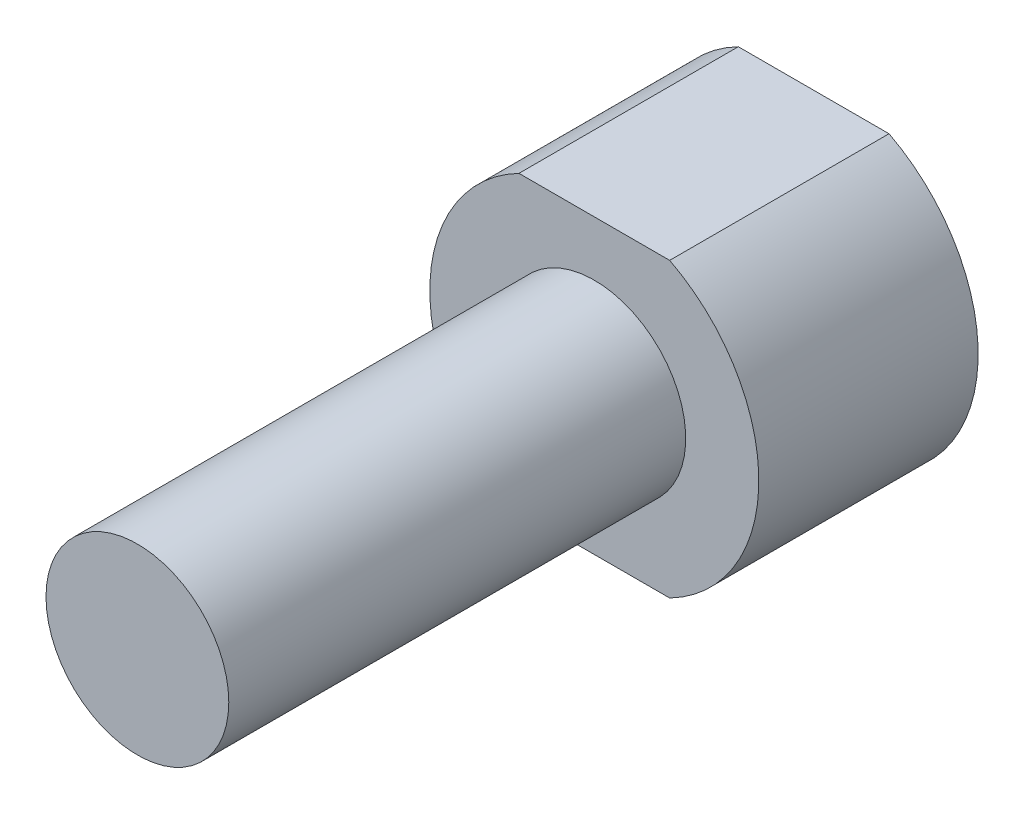
ISO-10303-21;
HEADER;
FILE_DESCRIPTION(('STEP AP214'),'2;1');
FILE_NAME('part.step','',(''),(''),'','','');
FILE_SCHEMA(('AUTOMOTIVE_DESIGN { 1 0 10303 214 1 1 1 1 }'));
ENDSEC;
DATA;
#1=APPLICATION_CONTEXT('core data for automotive mechanical design processes');
#2=APPLICATION_PROTOCOL_DEFINITION('international standard','automotive_design',2000,#1);
#3=PRODUCT_CONTEXT('',#1,'mechanical');
#4=PRODUCT('Part','Part','',(#3));
#5=PRODUCT_RELATED_PRODUCT_CATEGORY('part','',(#4));
#6=PRODUCT_DEFINITION_FORMATION('','',#4);
#7=PRODUCT_DEFINITION_CONTEXT('part definition',#1,'design');
#8=PRODUCT_DEFINITION('design','',#6,#7);
#9=PRODUCT_DEFINITION_SHAPE('','',#8);
#10=(LENGTH_UNIT() NAMED_UNIT(*) SI_UNIT(.MILLI.,.METRE.));
#11=(NAMED_UNIT(*) PLANE_ANGLE_UNIT() SI_UNIT($,.RADIAN.));
#12=(NAMED_UNIT(*) SI_UNIT($,.STERADIAN.) SOLID_ANGLE_UNIT());
#13=UNCERTAINTY_MEASURE_WITH_UNIT(LENGTH_MEASURE(1.E-05),#10,'distance_accuracy_value','');
#14=(GEOMETRIC_REPRESENTATION_CONTEXT(3) GLOBAL_UNCERTAINTY_ASSIGNED_CONTEXT((#13)) GLOBAL_UNIT_ASSIGNED_CONTEXT((#10,
#11,#12)) REPRESENTATION_CONTEXT('',''));
#15=CARTESIAN_POINT('',(0.,0.,0.));
#16=DIRECTION('',(0.,0.,1.));
#17=DIRECTION('',(1.,0.,0.));
#18=AXIS2_PLACEMENT_3D('',#15,#16,#17);
#19=CARTESIAN_POINT('',(0.,0.,12.));
#20=DIRECTION('',(0.,0.,-1.));
#21=DIRECTION('',(-1.,0.,0.));
#22=AXIS2_PLACEMENT_3D('',#19,#20,#21);
#23=CYLINDRICAL_SURFACE('',#22,9.);
#24=CARTESIAN_POINT('',(0.,0.,0.));
#25=DIRECTION('',(0.,0.,1.));
#26=DIRECTION('',(-1.,0.,0.));
#27=AXIS2_PLACEMENT_3D('',#24,#25,#26);
#28=CIRCLE('',#27,9.);
#29=CARTESIAN_POINT('',(4.12310562561766,-8.,0.));
#30=VERTEX_POINT('',#29);
#31=CARTESIAN_POINT('',(4.12310562561766,8.,0.));
#32=VERTEX_POINT('',#31);
#33=EDGE_CURVE('E102',#30,#32,#28,.T.);
#34=ORIENTED_EDGE('',*,*,#33,.T.);
#35=DIRECTION('',(0.,0.,-1.));
#36=VECTOR('',#35,1.);
#37=CARTESIAN_POINT('',(4.12310562561766,8.,12.));
#38=LINE('',#37,#36);
#39=CARTESIAN_POINT('',(4.12310562561766,8.,12.));
#40=VERTEX_POINT('',#39);
#41=EDGE_CURVE('E44',#40,#32,#38,.T.);
#42=ORIENTED_EDGE('',*,*,#41,.F.);
#43=CARTESIAN_POINT('',(0.,0.,12.));
#44=DIRECTION('',(0.,0.,1.));
#45=DIRECTION('',(-1.,0.,0.));
#46=AXIS2_PLACEMENT_3D('',#43,#44,#45);
#47=CIRCLE('',#46,9.);
#48=CARTESIAN_POINT('',(4.12310562561766,-8.,12.));
#49=VERTEX_POINT('',#48);
#50=EDGE_CURVE('E88',#49,#40,#47,.T.);
#51=ORIENTED_EDGE('',*,*,#50,.F.);
#52=DIRECTION('',(0.,0.,-1.));
#53=VECTOR('',#52,1.);
#54=CARTESIAN_POINT('',(4.12310562561766,-8.,12.));
#55=LINE('',#54,#53);
#56=EDGE_CURVE('E98',#49,#30,#55,.T.);
#57=ORIENTED_EDGE('',*,*,#56,.T.);
#58=EDGE_LOOP('',(#34,#42,#51,#57));
#59=FACE_BOUND('',#58,.T.);
#60=ADVANCED_FACE('F36',(#59),#23,.T.);
#61=CARTESIAN_POINT('',(-4.12310562561766,8.,12.));
#62=DIRECTION('',(0.,-1.,0.));
#63=DIRECTION('',(0.,0.,-1.));
#64=AXIS2_PLACEMENT_3D('',#61,#62,#63);
#65=PLANE('',#64);
#66=DIRECTION('',(-1.,0.,0.));
#67=VECTOR('',#66,1.);
#68=CARTESIAN_POINT('',(-4.12310562561766,8.,0.));
#69=LINE('',#68,#67);
#70=CARTESIAN_POINT('',(-4.12310562561766,8.,0.));
#71=VERTEX_POINT('',#70);
#72=EDGE_CURVE('E93',#32,#71,#69,.T.);
#73=ORIENTED_EDGE('',*,*,#72,.T.);
#74=DIRECTION('',(0.,0.,-1.));
#75=VECTOR('',#74,1.);
#76=CARTESIAN_POINT('',(-4.12310562561766,8.,12.));
#77=LINE('',#76,#75);
#78=CARTESIAN_POINT('',(-4.12310562561766,8.,12.));
#79=VERTEX_POINT('',#78);
#80=EDGE_CURVE('E91',#79,#71,#77,.T.);
#81=ORIENTED_EDGE('',*,*,#80,.F.);
#82=DIRECTION('',(-1.,0.,0.));
#83=VECTOR('',#82,1.);
#84=CARTESIAN_POINT('',(-4.12310562561766,8.,12.));
#85=LINE('',#84,#83);
#86=EDGE_CURVE('E83',#40,#79,#85,.T.);
#87=ORIENTED_EDGE('',*,*,#86,.F.);
#88=ORIENTED_EDGE('',*,*,#41,.T.);
#89=EDGE_LOOP('',(#73,#81,#87,#88));
#90=FACE_BOUND('',#89,.T.);
#91=ADVANCED_FACE('F92',(#90),#65,.F.);
#92=CARTESIAN_POINT('',(0.,0.,12.));
#93=DIRECTION('',(0.,0.,-1.));
#94=DIRECTION('',(-1.,0.,0.));
#95=AXIS2_PLACEMENT_3D('',#92,#93,#94);
#96=CYLINDRICAL_SURFACE('',#95,9.);
#97=CARTESIAN_POINT('',(0.,0.,0.));
#98=DIRECTION('',(0.,0.,1.));
#99=DIRECTION('',(1.,0.,0.));
#100=AXIS2_PLACEMENT_3D('',#97,#98,#99);
#101=CIRCLE('',#100,9.);
#102=CARTESIAN_POINT('',(-4.12310562561767,-7.99999999999999,0.));
#103=VERTEX_POINT('',#102);
#104=EDGE_CURVE('E69',#71,#103,#101,.T.);
#105=ORIENTED_EDGE('',*,*,#104,.T.);
#106=DIRECTION('',(0.,0.,-1.));
#107=VECTOR('',#106,1.);
#108=CARTESIAN_POINT('',(-4.12310562561767,-7.99999999999999,12.));
#109=LINE('',#108,#107);
#110=CARTESIAN_POINT('',(-4.12310562561767,-7.99999999999999,12.));
#111=VERTEX_POINT('',#110);
#112=EDGE_CURVE('E94',#111,#103,#109,.T.);
#113=ORIENTED_EDGE('',*,*,#112,.F.);
#114=CARTESIAN_POINT('',(0.,0.,12.));
#115=DIRECTION('',(0.,0.,1.));
#116=DIRECTION('',(1.,0.,0.));
#117=AXIS2_PLACEMENT_3D('',#114,#115,#116);
#118=CIRCLE('',#117,9.);
#119=EDGE_CURVE('E86',#79,#111,#118,.T.);
#120=ORIENTED_EDGE('',*,*,#119,.F.);
#121=ORIENTED_EDGE('',*,*,#80,.T.);
#122=EDGE_LOOP('',(#105,#113,#120,#121));
#123=FACE_BOUND('',#122,.T.);
#124=ADVANCED_FACE('F96',(#123),#96,.T.);
#125=CARTESIAN_POINT('',(4.12310562561766,-8.,12.));
#126=DIRECTION('',(0.,1.,0.));
#127=DIRECTION('',(0.,0.,1.));
#128=AXIS2_PLACEMENT_3D('',#125,#126,#127);
#129=PLANE('',#128);
#130=DIRECTION('',(1.,0.,0.));
#131=VECTOR('',#130,1.);
#132=CARTESIAN_POINT('',(4.12310562561766,-8.,0.));
#133=LINE('',#132,#131);
#134=EDGE_CURVE('E75',#103,#30,#133,.T.);
#135=ORIENTED_EDGE('',*,*,#134,.T.);
#136=ORIENTED_EDGE('',*,*,#56,.F.);
#137=DIRECTION('',(1.,0.,0.));
#138=VECTOR('',#137,1.);
#139=CARTESIAN_POINT('',(4.12310562561766,-8.,12.));
#140=LINE('',#139,#138);
#141=EDGE_CURVE('E52',#111,#49,#140,.T.);
#142=ORIENTED_EDGE('',*,*,#141,.F.);
#143=ORIENTED_EDGE('',*,*,#112,.T.);
#144=EDGE_LOOP('',(#135,#136,#142,#143));
#145=FACE_BOUND('',#144,.T.);
#146=ADVANCED_FACE('F124',(#145),#129,.F.);
#147=CARTESIAN_POINT('',(0.,0.,12.));
#148=DIRECTION('',(0.,0.,-1.));
#149=DIRECTION('',(-1.,0.,0.));
#150=AXIS2_PLACEMENT_3D('',#147,#148,#149);
#151=PLANE('',#150);
#152=CARTESIAN_POINT('',(0.,0.,12.));
#153=DIRECTION('',(0.,0.,-1.));
#154=DIRECTION('',(-1.,0.,0.));
#155=AXIS2_PLACEMENT_3D('',#152,#153,#154);
#156=CIRCLE('',#155,5.);
#157=CARTESIAN_POINT('',(-5.,0.,12.));
#158=VERTEX_POINT('',#157);
#159=EDGE_CURVE('E11',#158,#158,#156,.F.);
#160=ORIENTED_EDGE('',*,*,#159,.F.);
#161=EDGE_LOOP('',(#160));
#162=FACE_BOUND('',#161,.T.);
#163=ORIENTED_EDGE('',*,*,#50,.T.);
#164=ORIENTED_EDGE('',*,*,#86,.T.);
#165=ORIENTED_EDGE('',*,*,#119,.T.);
#166=ORIENTED_EDGE('',*,*,#141,.T.);
#167=EDGE_LOOP('',(#163,#164,#165,#166));
#168=FACE_BOUND('',#167,.T.);
#169=ADVANCED_FACE('F84',(#162,#168),#151,.F.);
#170=CARTESIAN_POINT('',(0.,0.,0.));
#171=DIRECTION('',(0.,0.,-1.));
#172=DIRECTION('',(-1.,0.,0.));
#173=AXIS2_PLACEMENT_3D('',#170,#171,#172);
#174=PLANE('',#173);
#175=ORIENTED_EDGE('',*,*,#33,.F.);
#176=ORIENTED_EDGE('',*,*,#134,.F.);
#177=ORIENTED_EDGE('',*,*,#104,.F.);
#178=ORIENTED_EDGE('',*,*,#72,.F.);
#179=EDGE_LOOP('',(#175,#176,#177,#178));
#180=FACE_BOUND('',#179,.T.);
#181=ADVANCED_FACE('F113',(#180),#174,.T.);
#182=CARTESIAN_POINT('',(0.,0.,37.));
#183=DIRECTION('',(0.,0.,-1.));
#184=DIRECTION('',(-1.,0.,0.));
#185=AXIS2_PLACEMENT_3D('',#182,#183,#184);
#186=CYLINDRICAL_SURFACE('',#185,5.);
#187=CARTESIAN_POINT('',(0.,0.,37.));
#188=DIRECTION('',(0.,0.,1.));
#189=DIRECTION('',(1.,0.,0.));
#190=AXIS2_PLACEMENT_3D('',#187,#188,#189);
#191=CIRCLE('',#190,5.);
#192=CARTESIAN_POINT('',(5.,0.,37.));
#193=VERTEX_POINT('',#192);
#194=EDGE_CURVE('E105',#193,#193,#191,.T.);
#195=ORIENTED_EDGE('',*,*,#194,.F.);
#196=EDGE_LOOP('',(#195));
#197=FACE_BOUND('',#196,.T.);
#198=ORIENTED_EDGE('',*,*,#159,.T.);
#199=EDGE_LOOP('',(#198));
#200=FACE_BOUND('',#199,.T.);
#201=ADVANCED_FACE('F115',(#197,#200),#186,.T.);
#202=CARTESIAN_POINT('',(0.,0.,37.));
#203=DIRECTION('',(0.,0.,1.));
#204=DIRECTION('',(1.,0.,0.));
#205=AXIS2_PLACEMENT_3D('',#202,#203,#204);
#206=PLANE('',#205);
#207=ORIENTED_EDGE('',*,*,#194,.T.);
#208=EDGE_LOOP('',(#207));
#209=FACE_BOUND('',#208,.T.);
#210=ADVANCED_FACE('F121',(#209),#206,.T.);
#211=CLOSED_SHELL('',(#60,#91,#124,#146,#169,#181,#201,#210));
#212=MANIFOLD_SOLID_BREP('B2',#211);
#213=ADVANCED_BREP_SHAPE_REPRESENTATION('',(#18,#212),#14);
#214=SHAPE_DEFINITION_REPRESENTATION(#9,#213);
ENDSEC;
END-ISO-10303-21;
